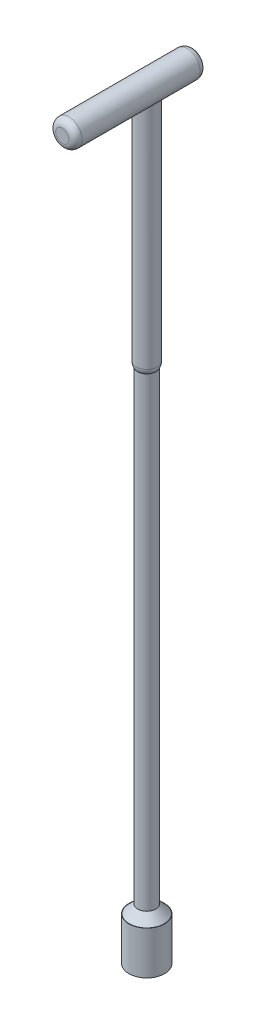
ISO-10303-21;
HEADER;
FILE_DESCRIPTION(('STEP AP214'),'2;1');
FILE_NAME('part.step','',(''),(''),'','','');
FILE_SCHEMA(('AUTOMOTIVE_DESIGN { 1 0 10303 214 1 1 1 1 }'));
ENDSEC;
DATA;
#1=APPLICATION_CONTEXT('core data for automotive mechanical design processes');
#2=APPLICATION_PROTOCOL_DEFINITION('international standard','automotive_design',2000,#1);
#3=PRODUCT_CONTEXT('',#1,'mechanical');
#4=PRODUCT('Part','Part','',(#3));
#5=PRODUCT_RELATED_PRODUCT_CATEGORY('part','',(#4));
#6=PRODUCT_DEFINITION_FORMATION('','',#4);
#7=PRODUCT_DEFINITION_CONTEXT('part definition',#1,'design');
#8=PRODUCT_DEFINITION('design','',#6,#7);
#9=PRODUCT_DEFINITION_SHAPE('','',#8);
#10=(LENGTH_UNIT() NAMED_UNIT(*) SI_UNIT(.MILLI.,.METRE.));
#11=(NAMED_UNIT(*) PLANE_ANGLE_UNIT() SI_UNIT($,.RADIAN.));
#12=(NAMED_UNIT(*) SI_UNIT($,.STERADIAN.) SOLID_ANGLE_UNIT());
#13=UNCERTAINTY_MEASURE_WITH_UNIT(LENGTH_MEASURE(1.E-05),#10,'distance_accuracy_value','');
#14=(GEOMETRIC_REPRESENTATION_CONTEXT(3) GLOBAL_UNCERTAINTY_ASSIGNED_CONTEXT((#13)) GLOBAL_UNIT_ASSIGNED_CONTEXT((#10,
#11,#12)) REPRESENTATION_CONTEXT('',''));
#15=CARTESIAN_POINT('',(0.,0.,0.));
#16=DIRECTION('',(0.,0.,1.));
#17=DIRECTION('',(1.,0.,0.));
#18=AXIS2_PLACEMENT_3D('',#15,#16,#17);
#19=CARTESIAN_POINT('',(0.,46.,0.));
#20=DIRECTION('',(0.,-1.,0.));
#21=DIRECTION('',(0.,0.,-1.));
#22=AXIS2_PLACEMENT_3D('',#19,#20,#21);
#23=CYLINDRICAL_SURFACE('',#22,19.);
#24=CARTESIAN_POINT('',(0.,46.,0.));
#25=DIRECTION('',(0.,1.,0.));
#26=DIRECTION('',(0.,0.,1.));
#27=AXIS2_PLACEMENT_3D('',#24,#25,#26);
#28=CIRCLE('',#27,19.);
#29=CARTESIAN_POINT('',(0.,46.,19.));
#30=VERTEX_POINT('',#29);
#31=EDGE_CURVE('E119',#30,#30,#28,.T.);
#32=ORIENTED_EDGE('',*,*,#31,.F.);
#33=EDGE_LOOP('',(#32));
#34=FACE_BOUND('',#33,.T.);
#35=CARTESIAN_POINT('',(0.,0.,0.));
#36=DIRECTION('',(0.,1.,0.));
#37=DIRECTION('',(0.,0.,1.));
#38=AXIS2_PLACEMENT_3D('',#35,#36,#37);
#39=CIRCLE('',#38,19.);
#40=CARTESIAN_POINT('',(0.,0.,19.));
#41=VERTEX_POINT('',#40);
#42=EDGE_CURVE('E122',#41,#41,#39,.T.);
#43=ORIENTED_EDGE('',*,*,#42,.T.);
#44=EDGE_LOOP('',(#43));
#45=FACE_BOUND('',#44,.T.);
#46=ADVANCED_FACE('F33',(#34,#45),#23,.T.);
#47=CARTESIAN_POINT('',(0.,46.,0.));
#48=DIRECTION('',(0.,1.,0.));
#49=DIRECTION('',(0.,0.,1.));
#50=AXIS2_PLACEMENT_3D('',#47,#48,#49);
#51=PLANE('',#50);
#52=CARTESIAN_POINT('',(0.,46.,0.));
#53=DIRECTION('',(0.,1.,0.));
#54=DIRECTION('',(0.,0.,1.));
#55=AXIS2_PLACEMENT_3D('',#52,#53,#54);
#56=CIRCLE('',#55,18.65);
#57=CARTESIAN_POINT('',(0.,46.,18.65));
#58=VERTEX_POINT('',#57);
#59=EDGE_CURVE('E114',#58,#58,#56,.F.);
#60=ORIENTED_EDGE('',*,*,#59,.T.);
#61=EDGE_LOOP('',(#60));
#62=FACE_BOUND('',#61,.T.);
#63=ORIENTED_EDGE('',*,*,#31,.T.);
#64=EDGE_LOOP('',(#63));
#65=FACE_BOUND('',#64,.T.);
#66=ADVANCED_FACE('F84',(#62,#65),#51,.T.);
#67=CARTESIAN_POINT('',(0.,0.,0.));
#68=DIRECTION('',(0.,1.,0.));
#69=DIRECTION('',(0.,0.,1.));
#70=AXIS2_PLACEMENT_3D('',#67,#68,#69);
#71=PLANE('',#70);
#72=ORIENTED_EDGE('',*,*,#42,.F.);
#73=EDGE_LOOP('',(#72));
#74=FACE_BOUND('',#73,.T.);
#75=ADVANCED_FACE('F90',(#74),#71,.F.);
#76=CARTESIAN_POINT('',(0.,551.,0.));
#77=DIRECTION('',(0.,-1.,0.));
#78=DIRECTION('',(0.,0.,-1.));
#79=AXIS2_PLACEMENT_3D('',#76,#77,#78);
#80=CYLINDRICAL_SURFACE('',#79,9.65);
#81=CARTESIAN_POINT('',(0.,55.,0.));
#82=DIRECTION('',(0.,1.,0.));
#83=DIRECTION('',(0.,0.,1.));
#84=AXIS2_PLACEMENT_3D('',#81,#82,#83);
#85=CIRCLE('',#84,9.65);
#86=CARTESIAN_POINT('',(0.,55.,9.65));
#87=VERTEX_POINT('',#86);
#88=EDGE_CURVE('E116',#87,#87,#85,.T.);
#89=ORIENTED_EDGE('',*,*,#88,.T.);
#90=EDGE_LOOP('',(#89));
#91=FACE_BOUND('',#90,.T.);
#92=CARTESIAN_POINT('',(0.,551.,0.));
#93=DIRECTION('',(0.,1.,0.));
#94=DIRECTION('',(0.,0.,1.));
#95=AXIS2_PLACEMENT_3D('',#92,#93,#94);
#96=CIRCLE('',#95,9.65);
#97=CARTESIAN_POINT('',(0.,551.,9.65));
#98=VERTEX_POINT('',#97);
#99=EDGE_CURVE('E62',#98,#98,#96,.T.);
#100=ORIENTED_EDGE('',*,*,#99,.F.);
#101=EDGE_LOOP('',(#100));
#102=FACE_BOUND('',#101,.T.);
#103=ADVANCED_FACE('F131',(#91,#102),#80,.T.);
#104=CARTESIAN_POINT('',(0.,801.,0.));
#105=DIRECTION('',(0.,-1.,0.));
#106=DIRECTION('',(0.,0.,-1.));
#107=AXIS2_PLACEMENT_3D('',#104,#105,#106);
#108=CYLINDRICAL_SURFACE('',#107,11.15);
#109=CARTESIAN_POINT('',(0.,794.95,-11.15));
#110=CARTESIAN_POINT('',(0.268385550641595,794.950001036614,-11.1499989357228));
#111=CARTESIAN_POINT('',(0.536787395240538,794.957706526716,-11.1402938334801));
#112=CARTESIAN_POINT('',(1.07143239843658,794.988352054552,-11.1016401904243));
#113=CARTESIAN_POINT('',(1.33767451090981,795.011299075341,-11.0726828289963));
#114=CARTESIAN_POINT('',(1.86618129487755,795.071944161233,-10.9959670660045));
#115=CARTESIAN_POINT('',(2.12843852927805,795.109666954021,-10.948177146789));
#116=CARTESIAN_POINT('',(2.64656097964095,795.199009861844,-10.8345999876461));
#117=CARTESIAN_POINT('',(2.90242678979866,795.250628679705,-10.7688144275768));
#118=CARTESIAN_POINT('',(3.40457924709833,795.36631675464,-10.6207081814883));
#119=CARTESIAN_POINT('',(3.65091598284823,795.430305741086,-10.5384939916475));
#120=CARTESIAN_POINT('',(4.13441230052008,795.569719008547,-10.3583637510948));
#121=CARTESIAN_POINT('',(4.37157186613814,795.645143309878,-10.260447672489));
#122=CARTESIAN_POINT('',(4.83569805381059,795.80610567159,-10.050046674661));
#123=CARTESIAN_POINT('',(5.06266648027867,795.891641931757,-9.93756434830429));
#124=CARTESIAN_POINT('',(5.50578100362908,796.071501157495,-9.69908296709517));
#125=CARTESIAN_POINT('',(5.72192489101319,796.165825905818,-9.5730811690176));
#126=CARTESIAN_POINT('',(6.2153522493699,796.395664287064,-9.26302063020483));
#127=CARTESIAN_POINT('',(6.48807589667692,796.534181027539,-9.07390550668604));
#128=CARTESIAN_POINT('',(7.01235781387474,796.821381675965,-8.67513079587516));
#129=CARTESIAN_POINT('',(7.26390937632463,796.970068779106,-8.46546474312389));
#130=CARTESIAN_POINT('',(7.74607375235494,797.274712698912,-8.02666693411893));
#131=CARTESIAN_POINT('',(7.97662960515681,797.430687650729,-7.7974853080181));
#132=CARTESIAN_POINT('',(8.41581151151419,797.746125143191,-7.32130678109205));
#133=CARTESIAN_POINT('',(8.62443999350876,797.905587295263,-7.07431185819508));
#134=CARTESIAN_POINT('',(9.02255076444543,798.226771514902,-6.55924018669028));
#135=CARTESIAN_POINT('',(9.21169561159964,798.388491271278,-6.29090101067577));
#136=CARTESIAN_POINT('',(9.56674761266776,798.707440461444,-5.73657046563788));
#137=CARTESIAN_POINT('',(9.73264756461212,798.864668491603,-5.45057366511559));
#138=CARTESIAN_POINT('',(10.0398031657952,799.168854788284,-4.8615644875683));
#139=CARTESIAN_POINT('',(10.181126707996,799.315840652524,-4.55860214521705));
#140=CARTESIAN_POINT('',(10.4380074737928,799.593289652122,-3.93500165381204));
#141=CARTESIAN_POINT('',(10.5535865512548,799.723766760411,-3.6143787869972));
#142=CARTESIAN_POINT('',(10.7731032926217,799.979158068972,-2.90215625266154));
#143=CARTESIAN_POINT('',(10.8721996781266,800.099822693777,-2.50742117742929));
#144=CARTESIAN_POINT('',(10.9886603124586,800.244677679264,-1.90110776371295));
#145=CARTESIAN_POINT('',(11.0221032494583,800.286920520074,-1.69679621326573));
#146=CARTESIAN_POINT('',(11.0777468465567,800.357774073711,-1.28424819014496));
#147=CARTESIAN_POINT('',(11.0999476301695,800.386384936308,-1.07601176061887));
#148=CARTESIAN_POINT('',(11.1327404561579,800.428808381943,-0.655341340882398));
#149=CARTESIAN_POINT('',(11.1432338421614,800.442495180745,-0.442886809302206));
#150=CARTESIAN_POINT('',(11.1520174468861,800.453944662417,-0.0172978915819425));
#151=CARTESIAN_POINT('',(11.1503081984994,800.451708040668,0.195836464463728));
#152=CARTESIAN_POINT('',(11.1347242768395,800.431419360479,0.621064759195495));
#153=CARTESIAN_POINT('',(11.1208398043592,800.413354562771,0.833157721416076));
#154=CARTESIAN_POINT('',(11.0812331533797,800.362303464204,1.25441416627021));
#155=CARTESIAN_POINT('',(11.0555093099147,800.329315064656,1.46357723260928));
#156=CARTESIAN_POINT('',(10.9875237856902,800.243270825858,1.91220635731914));
#157=CARTESIAN_POINT('',(10.9432165627082,800.187782444387,2.15089400609363));
#158=CARTESIAN_POINT('',(10.8402506337448,800.061427238112,2.62095646554752));
#159=CARTESIAN_POINT('',(10.7815887228642,799.990556979475,2.85232963011443));
#160=CARTESIAN_POINT('',(10.6507772001699,799.83628449128,3.30751543883522));
#161=CARTESIAN_POINT('',(10.5785971703056,799.752854083984,3.53130966110379));
#162=CARTESIAN_POINT('',(10.4216831509759,799.576360543154,3.9705718655846));
#163=CARTESIAN_POINT('',(10.3369448157589,799.483294078473,4.18603693285291));
#164=CARTESIAN_POINT('',(10.1128645461792,799.244468317981,4.7081783589198));
#165=CARTESIAN_POINT('',(9.96660726276382,799.094542908911,5.00999627391363));
#166=CARTESIAN_POINT('',(9.64986785688496,798.785717926881,5.59584664121479));
#167=CARTESIAN_POINT('',(9.47937507239209,798.626814422786,5.87987118595159));
#168=CARTESIAN_POINT('',(9.11481413438149,798.305054956708,6.43053611127153));
#169=CARTESIAN_POINT('',(8.92071968373709,798.142194750776,6.6971565824937));
#170=CARTESIAN_POINT('',(8.50957857742693,797.817054297068,7.21236183243688));
#171=CARTESIAN_POINT('',(8.29253554764709,797.654773961848,7.46094944992305));
#172=CARTESIAN_POINT('',(7.8303713388072,797.330841054243,7.94495631291134));
#173=CARTESIAN_POINT('',(7.58471334786372,797.169291401414,8.17993319853322));
#174=CARTESIAN_POINT('',(7.06978953965545,796.854563263551,8.62886048553857));
#175=CARTESIAN_POINT('',(6.80052030948502,796.701385993923,8.84280783768023));
#176=CARTESIAN_POINT('',(6.2395546138708,796.40752229448,9.24714646490131));
#177=CARTESIAN_POINT('',(5.94791187192618,796.266807589508,9.43759147005252));
#178=CARTESIAN_POINT('',(5.34268689315271,796.001259338241,9.7929150142048));
#179=CARTESIAN_POINT('',(5.02911489615431,795.87641845543,9.95780537174646));
#180=CARTESIAN_POINT('',(4.47597376493458,795.679806838537,10.2152965114125));
#181=CARTESIAN_POINT('',(4.24140376703902,795.603160801965,10.3149747582373));
#182=CARTESIAN_POINT('',(3.76305154464212,795.461013701401,10.4989315349646));
#183=CARTESIAN_POINT('',(3.51927162355068,795.395509872988,10.5832138850253));
#184=CARTESIAN_POINT('',(3.02380726532379,795.276882864596,10.7352785262239));
#185=CARTESIAN_POINT('',(2.77212692901735,795.223753378283,10.8030692227878));
#186=CARTESIAN_POINT('',(2.26225414455247,795.130903303073,10.9212260984807));
#187=CARTESIAN_POINT('',(2.00406151784179,795.091183082258,10.9715917992974));
#188=CARTESIAN_POINT('',(1.48170873367797,795.025857832993,11.054288599642));
#189=CARTESIAN_POINT('',(1.21752554066985,795.000322896758,11.0865301534394));
#190=CARTESIAN_POINT('',(0.686503658980518,794.964258918257,11.1320357950402));
#191=CARTESIAN_POINT('',(0.419664975742875,794.953729845236,11.1452999217378));
#192=CARTESIAN_POINT('',(-0.114416612809668,794.947928149613,11.1526108198084));
#193=CARTESIAN_POINT('',(-0.381659478258672,794.952654109417,11.1466593768139));
#194=CARTESIAN_POINT('',(-0.914320671453343,794.977247289899,11.1156503742439));
#195=CARTESIAN_POINT('',(-1.17973907867318,794.997113846774,11.0905936522928));
#196=CARTESIAN_POINT('',(-1.68685493935232,795.049477985827,11.0244019693021));
#197=CARTESIAN_POINT('',(-1.92883990435903,795.080917869748,10.9846120692134));
#198=CARTESIAN_POINT('',(-2.40786684580314,795.155743451997,10.8896416223625));
#199=CARTESIAN_POINT('',(-2.64490911776362,795.199128433914,10.8344619986026));
#200=CARTESIAN_POINT('',(-3.11273124435048,795.297061330688,10.7094368468867));
#201=CARTESIAN_POINT('',(-3.34351076844548,795.351609833435,10.6395905465553));
#202=CARTESIAN_POINT('',(-3.79776409956711,795.470969514957,10.4860382789735));
#203=CARTESIAN_POINT('',(-4.02123515450939,795.535784507208,10.4023271611213));
#204=CARTESIAN_POINT('',(-4.47492581958151,795.679415759993,10.2157598632054));
#205=CARTESIAN_POINT('',(-4.70455978613693,795.758886837013,10.111985253066));
#206=CARTESIAN_POINT('',(-5.15364678125461,795.927128985472,9.890658654558));
#207=CARTESIAN_POINT('',(-5.37309559396939,796.015903859276,9.7731010308664));
#208=CARTESIAN_POINT('',(-5.80106128416017,796.201384528228,9.52529833568359));
#209=CARTESIAN_POINT('',(-6.00958230274745,796.298087282939,9.39505812455103));
#210=CARTESIAN_POINT('',(-6.41541822518979,796.498155816862,9.12275389210938));
#211=CARTESIAN_POINT('',(-6.61273160115594,796.601522500456,8.98068826517049));
#212=CARTESIAN_POINT('',(-7.03255700737589,796.833912584646,8.65728897970301));
#213=CARTESIAN_POINT('',(-7.25266770058997,796.964061058216,8.4736426425125));
#214=CARTESIAN_POINT('',(-7.67637492573427,797.229769861774,8.09179385239712));
#215=CARTESIAN_POINT('',(-7.87996955600727,797.36533081228,7.89358972828262));
#216=CARTESIAN_POINT('',(-8.27108161512654,797.640027496457,7.48280604052637));
#217=CARTESIAN_POINT('',(-8.45854818234572,797.779172861405,7.27018452711842));
#218=CARTESIAN_POINT('',(-8.81655863220432,798.058230617572,6.83161268280134));
#219=CARTESIAN_POINT('',(-8.98710147835129,798.198143055218,6.60566153686915));
#220=CARTESIAN_POINT('',(-9.34433229388758,798.504663783814,6.09284013330782));
#221=CARTESIAN_POINT('',(-9.52713526210049,798.670849103102,5.80299341989352));
#222=CARTESIAN_POINT('',(-9.86709434543545,798.995094294068,5.20399790165975));
#223=CARTESIAN_POINT('',(-10.0242364258515,799.153149687092,4.89483866118095));
#224=CARTESIAN_POINT('',(-10.3106824854505,799.453524815243,4.25836158161573));
#225=CARTESIAN_POINT('',(-10.4401021235877,799.59590867272,3.93112664619913));
#226=CARTESIAN_POINT('',(-10.6694493539599,799.856939623449,3.25753368035237));
#227=CARTESIAN_POINT('',(-10.7694165495045,799.975618521803,2.9112020795908));
#228=CARTESIAN_POINT('',(-10.8978711587104,800.131859763304,2.36583996046731));
#229=CARTESIAN_POINT('',(-10.938011179996,800.181520719754,2.17295575064732));
#230=CARTESIAN_POINT('',(-11.0083228690438,800.26945019532,1.78285286939933));
#231=CARTESIAN_POINT('',(-11.0384986134128,800.307723372793,1.58563600586459));
#232=CARTESIAN_POINT('',(-11.0883165650018,800.371362967032,1.18817909577507));
#233=CARTESIAN_POINT('',(-11.1079784002454,800.396753429491,0.987945405153786));
#234=CARTESIAN_POINT('',(-11.1364487095288,800.433637879918,0.585414870848407));
#235=CARTESIAN_POINT('',(-11.1452571457446,800.445131819456,0.3831180199767));
#236=CARTESIAN_POINT('',(-11.1518295167524,800.453700782276,-0.0226643648234831));
#237=CARTESIAN_POINT('',(-11.1495552183358,800.450725891066,-0.226151591405912));
#238=CARTESIAN_POINT('',(-11.1339282890751,800.430385043855,-0.631964237014203));
#239=CARTESIAN_POINT('',(-11.1205757232426,800.413019172307,-0.834289662850946));
#240=CARTESIAN_POINT('',(-11.0830656637985,800.36466074199,-1.23653366076158));
#241=CARTESIAN_POINT('',(-11.058894465099,800.333650899832,-1.43644884861652));
#242=CARTESIAN_POINT('',(-11.0002059121166,800.259278968535,-1.83250979122599));
#243=CARTESIAN_POINT('',(-10.9656822688086,800.215909371743,-2.02865317734747));
#244=CARTESIAN_POINT('',(-10.8737190588022,800.102151179266,-2.48076785516967));
#245=CARTESIAN_POINT('',(-10.8124767784104,800.027574381797,-2.73491497737213));
#246=CARTESIAN_POINT('',(-10.673951646724,799.863218194008,-3.23361863943107));
#247=CARTESIAN_POINT('',(-10.5966683945575,799.773438423768,-3.47817493942649));
#248=CARTESIAN_POINT('',(-10.426962964527,799.582073797029,-3.95801527980559));
#249=CARTESIAN_POINT('',(-10.3344995744136,799.480457028923,-4.19327185316565));
#250=CARTESIAN_POINT('',(-10.135476961622,799.268827123995,-4.65376497369337));
#251=CARTESIAN_POINT('',(-10.0289175899614,799.158813898433,-4.87900141492323));
#252=CARTESIAN_POINT('',(-9.75648497708835,798.887439998579,-5.40875418337969));
#253=CARTESIAN_POINT('',(-9.58405254756718,798.723306873518,-5.70849363460881));
#254=CARTESIAN_POINT('',(-9.21365789320011,798.38994894914,-6.28884282890928));
#255=CARTESIAN_POINT('',(-9.01568562595092,798.220722167146,-6.56944498038979));
#256=CARTESIAN_POINT('',(-8.59488029703647,797.882292472506,-7.11112401040592));
#257=CARTESIAN_POINT('',(-8.37205809254446,797.713089581526,-7.37220933339462));
#258=CARTESIAN_POINT('',(-7.90182058638977,797.379032455679,-7.87413031826077));
#259=CARTESIAN_POINT('',(-7.65441278416947,797.21417691402,-8.11497211397727));
#260=CARTESIAN_POINT('',(-7.17825157761689,796.919432233964,-8.53691587554512));
#261=CARTESIAN_POINT('',(-6.95319284489922,796.78827326873,-8.72130635493897));
#262=CARTESIAN_POINT('',(-6.48636523275058,796.534038859863,-9.07386935866436));
#263=CARTESIAN_POINT('',(-6.24459661124784,796.410963291514,-9.24204213323102));
#264=CARTESIAN_POINT('',(-5.74510263111818,796.175317733219,-9.56054046017598));
#265=CARTESIAN_POINT('',(-5.48739415787844,796.062736932604,-9.71088442247317));
#266=CARTESIAN_POINT('',(-4.95663934117993,795.850251657652,-9.99221595012003));
#267=CARTESIAN_POINT('',(-4.68359631434464,795.750344457332,-10.1232076789726));
#268=CARTESIAN_POINT('',(-4.17186020814181,795.581444598205,-10.3431954359183));
#269=CARTESIAN_POINT('',(-3.93538004608516,795.510092853197,-10.4355371703121));
#270=CARTESIAN_POINT('',(-3.45384162148686,795.378850303524,-10.604648265139));
#271=CARTESIAN_POINT('',(-3.20878499135338,795.318957331727,-10.681420570292));
#272=CARTESIAN_POINT('',(-2.7118340336026,795.211855010267,-10.8182601388949));
#273=CARTESIAN_POINT('',(-2.45995317585508,795.164622430782,-10.8783580045256));
#274=CARTESIAN_POINT('',(-1.95061255346008,795.083676540705,-10.9811230042739));
#275=CARTESIAN_POINT('',(-1.69315518868226,795.049957531729,-11.0237974856034));
#276=CARTESIAN_POINT('',(-1.1969910847592,794.999057408222,-11.0881352555695));
#277=CARTESIAN_POINT('',(-0.958599807200135,794.98069350699,-11.1113025078182));
#278=CARTESIAN_POINT('',(-0.480143586973103,794.956163093702,-11.1422369286261));
#279=CARTESIAN_POINT('',(-0.240078312534541,794.94999907272,-11.1500009520254));
#280=CARTESIAN_POINT('',(0.,794.95,-11.15));
#281=B_SPLINE_CURVE_WITH_KNOTS('',3,(#109,#110,#111,#112,#113,#114,#115,#116,#117,#118,#119,
#120,#121,#122,#123,#124,#125,#126,#127,#128,#129,#130,#131,#132,#133,#134,#135,#136,#137,#138,
#139,#140,#141,#142,#143,#144,#145,#146,#147,#148,#149,#150,#151,#152,#153,#154,#155,#156,#157,
#158,#159,#160,#161,#162,#163,#164,#165,#166,#167,#168,#169,#170,#171,#172,#173,#174,#175,#176,
#177,#178,#179,#180,#181,#182,#183,#184,#185,#186,#187,#188,#189,#190,#191,#192,#193,#194,#195,
#196,#197,#198,#199,#200,#201,#202,#203,#204,#205,#206,#207,#208,#209,#210,#211,#212,#213,#214,
#215,#216,#217,#218,#219,#220,#221,#222,#223,#224,#225,#226,#227,#228,#229,#230,#231,#232,#233,
#234,#235,#236,#237,#238,#239,#240,#241,#242,#243,#244,#245,#246,#247,#248,#249,#250,#251,#252,
#253,#254,#255,#256,#257,#258,#259,#260,#261,#262,#263,#264,#265,#266,#267,#268,#269,#270,#271,
#272,#273,#274,#275,#276,#277,#278,#279,#280),.UNSPECIFIED.,.T.,.F.,(4,2,2,2,2,2,2,2,2,2,2,2,2,
2,2,2,2,2,2,2,2,2,2,2,2,2,2,2,2,2,2,2,2,2,2,2,2,2,2,2,2,2,2,2,2,2,2,2,2,2,2,2,2,2,2,2,2,2,2,2,2,
2,2,2,2,2,2,2,2,2,2,2,2,2,2,2,2,2,2,2,2,2,2,2,2,4),(0.,0.804901884559715,1.61017279731992,
2.4167971521877,3.223346235915,4.02482735246841,4.8263098928452,5.62764996089687,
6.42915293681887,7.50650319853208,8.58419349640538,9.66472547319612,10.7451376555431,
11.841896529448,12.9389944644528,14.0330117549927,15.1260967906535,16.3945207131217,
17.027766519666,17.6610053687911,18.2995410384304,18.9380488232295,19.5770709820259,
20.2161830337146,20.9621181831989,21.7082200260834,22.4560213468179,23.2040820480853,
24.3046130067695,25.4056296339181,26.5078844592939,27.6099653874215,28.7377506671014,
29.8656992329889,30.9910193831687,32.1158175309574,32.9135029374365,33.7109901459103,
34.5080700374348,35.3051718068907,36.1061779511737,36.9071824537878,37.7081125241313,
38.509007481673,39.2499060223891,39.9907601370991,40.7316532763993,41.472822267869,
42.264740757991,43.0569841685003,43.8489251528975,44.6409738413049,45.5845575133712,
46.528249675783,47.4748164060952,48.4214410731072,49.5626103912185,50.7044017735051,
51.8413325544559,52.9767275068487,53.5857547643588,54.1945325457064,54.8021698193455,
55.4098092105867,56.0195463166805,56.6292798446261,57.2397879813144,57.8506677506455,
58.6649421640324,59.4792369289931,60.2957801176069,61.1123319370704,62.2591182500223,
63.4063568678757,64.5530961955781,65.6994867963433,66.6560516585995,67.6126017589376,
68.5681553686429,69.523503097096,70.3138373277265,71.1040219390056,71.8927466043516,
72.6811383305165,73.4009983997276,74.1210054408631),.UNSPECIFIED.);
#282=CARTESIAN_POINT('',(0.,794.95,-11.15));
#283=VERTEX_POINT('',#282);
#284=EDGE_CURVE('E54',#283,#283,#281,.T.);
#285=ORIENTED_EDGE('',*,*,#284,.T.);
#286=EDGE_LOOP('',(#285));
#287=FACE_BOUND('',#286,.T.);
#288=CARTESIAN_POINT('',(0.,556.267826876426,0.));
#289=DIRECTION('',(0.,-1.,0.));
#290=DIRECTION('',(0.,0.,-1.));
#291=AXIS2_PLACEMENT_3D('',#288,#289,#290);
#292=CIRCLE('',#291,11.15);
#293=CARTESIAN_POINT('',(0.,556.267826876426,-11.15));
#294=VERTEX_POINT('',#293);
#295=EDGE_CURVE('E53',#294,#294,#292,.F.);
#296=ORIENTED_EDGE('',*,*,#295,.T.);
#297=EDGE_LOOP('',(#296));
#298=FACE_BOUND('',#297,.T.);
#299=ADVANCED_FACE('F64',(#287,#298),#108,.T.);
#300=CARTESIAN_POINT('',(0.,55.,0.));
#301=DIRECTION('',(0.,-1.,0.));
#302=DIRECTION('',(0.,0.,-1.));
#303=AXIS2_PLACEMENT_3D('',#300,#301,#302);
#304=CONICAL_SURFACE('',#303,9.65,0.785398163397445);
#305=ORIENTED_EDGE('',*,*,#59,.F.);
#306=EDGE_LOOP('',(#305));
#307=FACE_BOUND('',#306,.T.);
#308=ORIENTED_EDGE('',*,*,#88,.F.);
#309=EDGE_LOOP('',(#308));
#310=FACE_BOUND('',#309,.T.);
#311=ADVANCED_FACE('F98',(#307,#310),#304,.T.);
#312=CARTESIAN_POINT('',(0.,556.267826876426,0.));
#313=DIRECTION('',(0.,-1.,0.));
#314=DIRECTION('',(0.,0.,-1.));
#315=AXIS2_PLACEMENT_3D('',#312,#313,#314);
#316=DEGENERATE_TOROIDAL_SURFACE('',#315,1.15,10.,.T.);
#317=ORIENTED_EDGE('',*,*,#99,.T.);
#318=EDGE_LOOP('',(#317));
#319=FACE_BOUND('',#318,.T.);
#320=ORIENTED_EDGE('',*,*,#295,.F.);
#321=EDGE_LOOP('',(#320));
#322=FACE_BOUND('',#321,.T.);
#323=ADVANCED_FACE('F72',(#319,#322),#316,.T.);
#324=CARTESIAN_POINT('',(0.,809.,-49.9999999999999));
#325=DIRECTION('',(0.,0.,1.));
#326=DIRECTION('',(1.,0.,0.));
#327=AXIS2_PLACEMENT_3D('',#324,#325,#326);
#328=CYLINDRICAL_SURFACE('',#327,14.05);
#329=CARTESIAN_POINT('',(0.,809.,-42.9999999999999));
#330=DIRECTION('',(0.,0.,1.));
#331=DIRECTION('',(1.,0.,0.));
#332=AXIS2_PLACEMENT_3D('',#329,#330,#331);
#333=CIRCLE('',#332,14.05);
#334=CARTESIAN_POINT('',(14.05,809.,-42.9999999999999));
#335=VERTEX_POINT('',#334);
#336=EDGE_CURVE('E44',#335,#335,#333,.T.);
#337=ORIENTED_EDGE('',*,*,#336,.T.);
#338=EDGE_LOOP('',(#337));
#339=FACE_BOUND('',#338,.T.);
#340=CARTESIAN_POINT('',(0.,809.,82.9999999999999));
#341=DIRECTION('',(0.,0.,1.));
#342=DIRECTION('',(1.,0.,0.));
#343=AXIS2_PLACEMENT_3D('',#340,#341,#342);
#344=CIRCLE('',#343,14.05);
#345=CARTESIAN_POINT('',(14.05,809.,82.9999999999999));
#346=VERTEX_POINT('',#345);
#347=EDGE_CURVE('E48',#346,#346,#344,.F.);
#348=ORIENTED_EDGE('',*,*,#347,.T.);
#349=EDGE_LOOP('',(#348));
#350=FACE_BOUND('',#349,.T.);
#351=ORIENTED_EDGE('',*,*,#284,.F.);
#352=EDGE_LOOP('',(#351));
#353=FACE_BOUND('',#352,.T.);
#354=ADVANCED_FACE('F67',(#339,#350,#353),#328,.T.);
#355=CARTESIAN_POINT('',(0.,809.,-49.9999999999999));
#356=DIRECTION('',(0.,0.,1.));
#357=DIRECTION('',(1.,0.,0.));
#358=AXIS2_PLACEMENT_3D('',#355,#356,#357);
#359=PLANE('',#358);
#360=CARTESIAN_POINT('',(0.,809.,-49.9999999999999));
#361=DIRECTION('',(0.,0.,1.));
#362=DIRECTION('',(1.,0.,0.));
#363=AXIS2_PLACEMENT_3D('',#360,#361,#362);
#364=CIRCLE('',#363,7.04999999999999);
#365=CARTESIAN_POINT('',(7.04999999999999,809.,-49.9999999999999));
#366=VERTEX_POINT('',#365);
#367=EDGE_CURVE('E40',#366,#366,#364,.F.);
#368=ORIENTED_EDGE('',*,*,#367,.T.);
#369=EDGE_LOOP('',(#368));
#370=FACE_BOUND('',#369,.T.);
#371=ADVANCED_FACE('F71',(#370),#359,.F.);
#372=CARTESIAN_POINT('',(0.,809.,89.9999999999999));
#373=DIRECTION('',(0.,0.,1.));
#374=DIRECTION('',(1.,0.,0.));
#375=AXIS2_PLACEMENT_3D('',#372,#373,#374);
#376=PLANE('',#375);
#377=CARTESIAN_POINT('',(0.,809.,89.9999999999999));
#378=DIRECTION('',(0.,0.,1.));
#379=DIRECTION('',(1.,0.,0.));
#380=AXIS2_PLACEMENT_3D('',#377,#378,#379);
#381=CIRCLE('',#380,7.04999999999999);
#382=CARTESIAN_POINT('',(7.04999999999999,809.,89.9999999999999));
#383=VERTEX_POINT('',#382);
#384=EDGE_CURVE('E10',#383,#383,#381,.T.);
#385=ORIENTED_EDGE('',*,*,#384,.T.);
#386=EDGE_LOOP('',(#385));
#387=FACE_BOUND('',#386,.T.);
#388=ADVANCED_FACE('F76',(#387),#376,.T.);
#389=CARTESIAN_POINT('',(0.,809.,-42.9999999999999));
#390=DIRECTION('',(0.,0.,1.));
#391=DIRECTION('',(1.,0.,0.));
#392=AXIS2_PLACEMENT_3D('',#389,#390,#391);
#393=TOROIDAL_SURFACE('',#392,7.04999999999999,7.);
#394=ORIENTED_EDGE('',*,*,#367,.F.);
#395=EDGE_LOOP('',(#394));
#396=FACE_BOUND('',#395,.T.);
#397=ORIENTED_EDGE('',*,*,#336,.F.);
#398=EDGE_LOOP('',(#397));
#399=FACE_BOUND('',#398,.T.);
#400=ADVANCED_FACE('F78',(#396,#399),#393,.T.);
#401=CARTESIAN_POINT('',(0.,809.,82.9999999999999));
#402=DIRECTION('',(0.,0.,1.));
#403=DIRECTION('',(1.,0.,0.));
#404=AXIS2_PLACEMENT_3D('',#401,#402,#403);
#405=TOROIDAL_SURFACE('',#404,7.04999999999999,7.);
#406=ORIENTED_EDGE('',*,*,#347,.F.);
#407=EDGE_LOOP('',(#406));
#408=FACE_BOUND('',#407,.T.);
#409=ORIENTED_EDGE('',*,*,#384,.F.);
#410=EDGE_LOOP('',(#409));
#411=FACE_BOUND('',#410,.T.);
#412=ADVANCED_FACE('F35',(#408,#411),#405,.T.);
#413=CLOSED_SHELL('',(#46,#66,#75,#103,#299,#311,#323,#354,#371,#388,#400,#412));
#414=MANIFOLD_SOLID_BREP('B2',#413);
#415=ADVANCED_BREP_SHAPE_REPRESENTATION('',(#18,#414),#14);
#416=SHAPE_DEFINITION_REPRESENTATION(#9,#415);
ENDSEC;
END-ISO-10303-21;
